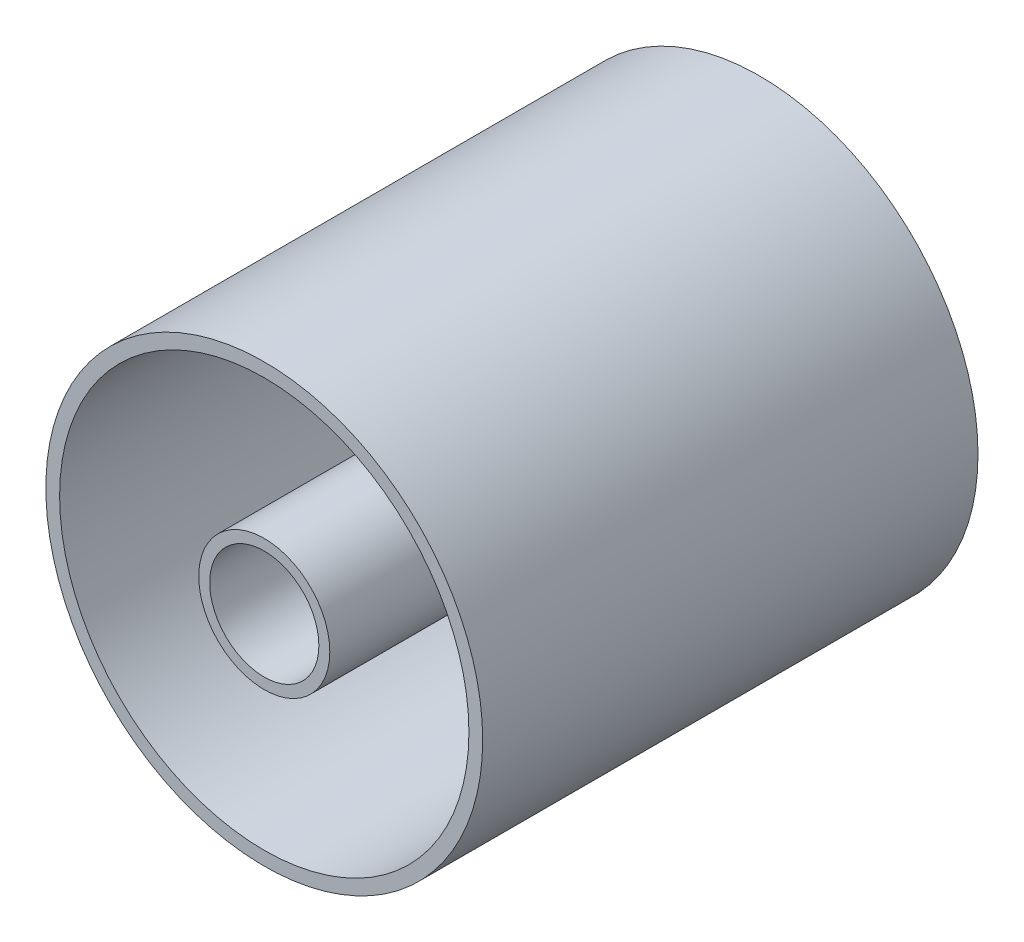
ISO-10303-21;
HEADER;
FILE_DESCRIPTION(('STEP AP214'),'2;1');
FILE_NAME('part.step','',(''),(''),'','','');
FILE_SCHEMA(('AUTOMOTIVE_DESIGN { 1 0 10303 214 1 1 1 1 }'));
ENDSEC;
DATA;
#1=APPLICATION_CONTEXT('core data for automotive mechanical design processes');
#2=APPLICATION_PROTOCOL_DEFINITION('international standard','automotive_design',2000,#1);
#3=PRODUCT_CONTEXT('',#1,'mechanical');
#4=PRODUCT('Part','Part','',(#3));
#5=PRODUCT_RELATED_PRODUCT_CATEGORY('part','',(#4));
#6=PRODUCT_DEFINITION_FORMATION('','',#4);
#7=PRODUCT_DEFINITION_CONTEXT('part definition',#1,'design');
#8=PRODUCT_DEFINITION('design','',#6,#7);
#9=PRODUCT_DEFINITION_SHAPE('','',#8);
#10=(LENGTH_UNIT() NAMED_UNIT(*) SI_UNIT(.MILLI.,.METRE.));
#11=(NAMED_UNIT(*) PLANE_ANGLE_UNIT() SI_UNIT($,.RADIAN.));
#12=(NAMED_UNIT(*) SI_UNIT($,.STERADIAN.) SOLID_ANGLE_UNIT());
#13=UNCERTAINTY_MEASURE_WITH_UNIT(LENGTH_MEASURE(1.E-05),#10,'distance_accuracy_value','');
#14=(GEOMETRIC_REPRESENTATION_CONTEXT(3) GLOBAL_UNCERTAINTY_ASSIGNED_CONTEXT((#13)) GLOBAL_UNIT_ASSIGNED_CONTEXT((#10,
#11,#12)) REPRESENTATION_CONTEXT('',''));
#15=CARTESIAN_POINT('',(0.,0.,0.));
#16=DIRECTION('',(0.,0.,1.));
#17=DIRECTION('',(1.,0.,0.));
#18=AXIS2_PLACEMENT_3D('',#15,#16,#17);
#19=CARTESIAN_POINT('',(0.,0.,2.));
#20=DIRECTION('',(0.,0.,1.));
#21=DIRECTION('',(1.,0.,0.));
#22=AXIS2_PLACEMENT_3D('',#19,#20,#21);
#23=PLANE('',#22);
#24=CARTESIAN_POINT('',(0.,0.,2.));
#25=DIRECTION('',(0.,0.,1.));
#26=DIRECTION('',(1.,0.,0.));
#27=AXIS2_PLACEMENT_3D('',#24,#25,#26);
#28=CIRCLE('',#27,29.75);
#29=CARTESIAN_POINT('',(29.75,0.,2.));
#30=VERTEX_POINT('',#29);
#31=EDGE_CURVE('E10',#30,#30,#28,.F.);
#32=ORIENTED_EDGE('',*,*,#31,.F.);
#33=EDGE_LOOP('',(#32));
#34=FACE_BOUND('',#33,.T.);
#35=CARTESIAN_POINT('',(0.,0.,2.));
#36=DIRECTION('',(0.,0.,1.));
#37=DIRECTION('',(1.,0.,0.));
#38=AXIS2_PLACEMENT_3D('',#35,#36,#37);
#39=CIRCLE('',#38,9.525);
#40=CARTESIAN_POINT('',(9.525,0.,2.));
#41=VERTEX_POINT('',#40);
#42=EDGE_CURVE('E55',#41,#41,#39,.T.);
#43=ORIENTED_EDGE('',*,*,#42,.F.);
#44=EDGE_LOOP('',(#43));
#45=FACE_BOUND('',#44,.T.);
#46=ADVANCED_FACE('F31',(#34,#45),#23,.T.);
#47=CARTESIAN_POINT('',(0.,0.,0.));
#48=DIRECTION('',(0.,0.,1.));
#49=DIRECTION('',(1.,0.,0.));
#50=AXIS2_PLACEMENT_3D('',#47,#48,#49);
#51=PLANE('',#50);
#52=CARTESIAN_POINT('',(0.,0.,0.));
#53=DIRECTION('',(0.,0.,1.));
#54=DIRECTION('',(1.,0.,0.));
#55=AXIS2_PLACEMENT_3D('',#52,#53,#54);
#56=CIRCLE('',#55,31.75);
#57=CARTESIAN_POINT('',(31.75,0.,0.));
#58=VERTEX_POINT('',#57);
#59=EDGE_CURVE('E38',#58,#58,#56,.T.);
#60=ORIENTED_EDGE('',*,*,#59,.F.);
#61=EDGE_LOOP('',(#60));
#62=FACE_BOUND('',#61,.T.);
#63=CARTESIAN_POINT('',(0.,0.,0.));
#64=DIRECTION('',(0.,0.,1.));
#65=DIRECTION('',(1.,0.,0.));
#66=AXIS2_PLACEMENT_3D('',#63,#64,#65);
#67=CIRCLE('',#66,7.9375);
#68=CARTESIAN_POINT('',(7.9375,0.,0.));
#69=VERTEX_POINT('',#68);
#70=EDGE_CURVE('E42',#69,#69,#67,.T.);
#71=ORIENTED_EDGE('',*,*,#70,.T.);
#72=EDGE_LOOP('',(#71));
#73=FACE_BOUND('',#72,.T.);
#74=ADVANCED_FACE('F82',(#62,#73),#51,.F.);
#75=CARTESIAN_POINT('',(0.,0.,2.));
#76=DIRECTION('',(0.,0.,-1.));
#77=DIRECTION('',(-1.,0.,0.));
#78=AXIS2_PLACEMENT_3D('',#75,#76,#77);
#79=CYLINDRICAL_SURFACE('',#78,31.75);
#80=ORIENTED_EDGE('',*,*,#59,.T.);
#81=EDGE_LOOP('',(#80));
#82=FACE_BOUND('',#81,.T.);
#83=CARTESIAN_POINT('',(0.,0.,72.));
#84=DIRECTION('',(0.,0.,1.));
#85=DIRECTION('',(1.,0.,0.));
#86=AXIS2_PLACEMENT_3D('',#83,#84,#85);
#87=CIRCLE('',#86,31.75);
#88=CARTESIAN_POINT('',(31.75,0.,72.));
#89=VERTEX_POINT('',#88);
#90=EDGE_CURVE('E46',#89,#89,#87,.T.);
#91=ORIENTED_EDGE('',*,*,#90,.F.);
#92=EDGE_LOOP('',(#91));
#93=FACE_BOUND('',#92,.T.);
#94=ADVANCED_FACE('F33',(#82,#93),#79,.T.);
#95=CARTESIAN_POINT('',(0.,0.,2.));
#96=DIRECTION('',(0.,0.,-1.));
#97=DIRECTION('',(-1.,0.,0.));
#98=AXIS2_PLACEMENT_3D('',#95,#96,#97);
#99=CYLINDRICAL_SURFACE('',#98,7.9375);
#100=ORIENTED_EDGE('',*,*,#70,.F.);
#101=EDGE_LOOP('',(#100));
#102=FACE_BOUND('',#101,.T.);
#103=CARTESIAN_POINT('',(0.,0.,72.));
#104=DIRECTION('',(0.,0.,1.));
#105=DIRECTION('',(1.,0.,0.));
#106=AXIS2_PLACEMENT_3D('',#103,#104,#105);
#107=CIRCLE('',#106,7.9375);
#108=CARTESIAN_POINT('',(7.9375,0.,72.));
#109=VERTEX_POINT('',#108);
#110=EDGE_CURVE('E58',#109,#109,#107,.T.);
#111=ORIENTED_EDGE('',*,*,#110,.T.);
#112=EDGE_LOOP('',(#111));
#113=FACE_BOUND('',#112,.T.);
#114=ADVANCED_FACE('F64',(#102,#113),#99,.F.);
#115=CARTESIAN_POINT('',(0.,0.,72.));
#116=DIRECTION('',(0.,0.,1.));
#117=DIRECTION('',(1.,0.,0.));
#118=AXIS2_PLACEMENT_3D('',#115,#116,#117);
#119=PLANE('',#118);
#120=ORIENTED_EDGE('',*,*,#90,.T.);
#121=EDGE_LOOP('',(#120));
#122=FACE_BOUND('',#121,.T.);
#123=CARTESIAN_POINT('',(0.,0.,72.));
#124=DIRECTION('',(0.,0.,1.));
#125=DIRECTION('',(1.,0.,0.));
#126=AXIS2_PLACEMENT_3D('',#123,#124,#125);
#127=CIRCLE('',#126,29.75);
#128=CARTESIAN_POINT('',(29.75,0.,72.));
#129=VERTEX_POINT('',#128);
#130=EDGE_CURVE('E51',#129,#129,#127,.T.);
#131=ORIENTED_EDGE('',*,*,#130,.F.);
#132=EDGE_LOOP('',(#131));
#133=FACE_BOUND('',#132,.T.);
#134=ADVANCED_FACE('F78',(#122,#133),#119,.T.);
#135=CARTESIAN_POINT('',(0.,0.,72.));
#136=DIRECTION('',(0.,0.,-1.));
#137=DIRECTION('',(-1.,0.,0.));
#138=AXIS2_PLACEMENT_3D('',#135,#136,#137);
#139=CYLINDRICAL_SURFACE('',#138,29.75);
#140=ORIENTED_EDGE('',*,*,#130,.T.);
#141=EDGE_LOOP('',(#140));
#142=FACE_BOUND('',#141,.T.);
#143=ORIENTED_EDGE('',*,*,#31,.T.);
#144=EDGE_LOOP('',(#143));
#145=FACE_BOUND('',#144,.T.);
#146=ADVANCED_FACE('F69',(#142,#145),#139,.F.);
#147=CARTESIAN_POINT('',(0.,0.,72.));
#148=DIRECTION('',(0.,0.,1.));
#149=DIRECTION('',(1.,0.,0.));
#150=AXIS2_PLACEMENT_3D('',#147,#148,#149);
#151=PLANE('',#150);
#152=CARTESIAN_POINT('',(0.,0.,72.));
#153=DIRECTION('',(0.,0.,1.));
#154=DIRECTION('',(1.,0.,0.));
#155=AXIS2_PLACEMENT_3D('',#152,#153,#154);
#156=CIRCLE('',#155,9.525);
#157=CARTESIAN_POINT('',(9.525,0.,72.));
#158=VERTEX_POINT('',#157);
#159=EDGE_CURVE('E54',#158,#158,#156,.T.);
#160=ORIENTED_EDGE('',*,*,#159,.T.);
#161=EDGE_LOOP('',(#160));
#162=FACE_BOUND('',#161,.T.);
#163=ORIENTED_EDGE('',*,*,#110,.F.);
#164=EDGE_LOOP('',(#163));
#165=FACE_BOUND('',#164,.T.);
#166=ADVANCED_FACE('F66',(#162,#165),#151,.T.);
#167=CARTESIAN_POINT('',(0.,0.,72.));
#168=DIRECTION('',(0.,0.,-1.));
#169=DIRECTION('',(-1.,0.,0.));
#170=AXIS2_PLACEMENT_3D('',#167,#168,#169);
#171=CYLINDRICAL_SURFACE('',#170,9.525);
#172=ORIENTED_EDGE('',*,*,#159,.F.);
#173=EDGE_LOOP('',(#172));
#174=FACE_BOUND('',#173,.T.);
#175=ORIENTED_EDGE('',*,*,#42,.T.);
#176=EDGE_LOOP('',(#175));
#177=FACE_BOUND('',#176,.T.);
#178=ADVANCED_FACE('F68',(#174,#177),#171,.T.);
#179=CLOSED_SHELL('',(#46,#74,#94,#114,#134,#146,#166,#178));
#180=MANIFOLD_SOLID_BREP('B2',#179);
#181=ADVANCED_BREP_SHAPE_REPRESENTATION('',(#18,#180),#14);
#182=SHAPE_DEFINITION_REPRESENTATION(#9,#181);
ENDSEC;
END-ISO-10303-21;
